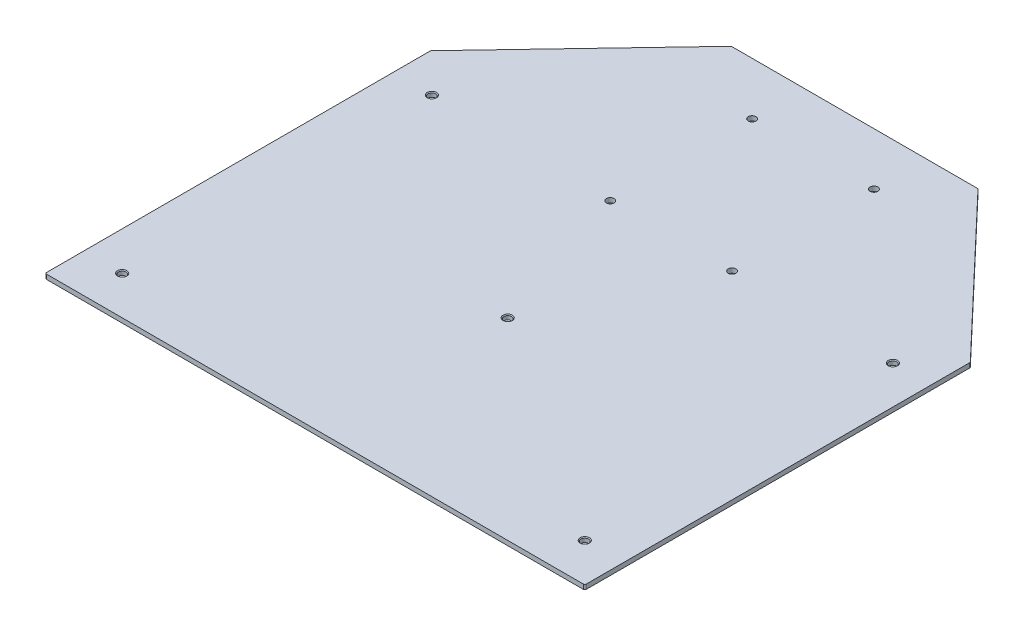
ISO-10303-21;
HEADER;
FILE_DESCRIPTION(('STEP AP214'),'2;1');
FILE_NAME('part.step','',(''),(''),'','','');
FILE_SCHEMA(('AUTOMOTIVE_DESIGN { 1 0 10303 214 1 1 1 1 }'));
ENDSEC;
DATA;
#1=APPLICATION_CONTEXT('core data for automotive mechanical design processes');
#2=APPLICATION_PROTOCOL_DEFINITION('international standard','automotive_design',2000,#1);
#3=PRODUCT_CONTEXT('',#1,'mechanical');
#4=PRODUCT('Part','Part','',(#3));
#5=PRODUCT_RELATED_PRODUCT_CATEGORY('part','',(#4));
#6=PRODUCT_DEFINITION_FORMATION('','',#4);
#7=PRODUCT_DEFINITION_CONTEXT('part definition',#1,'design');
#8=PRODUCT_DEFINITION('design','',#6,#7);
#9=PRODUCT_DEFINITION_SHAPE('','',#8);
#10=(LENGTH_UNIT() NAMED_UNIT(*) SI_UNIT(.MILLI.,.METRE.));
#11=(NAMED_UNIT(*) PLANE_ANGLE_UNIT() SI_UNIT($,.RADIAN.));
#12=(NAMED_UNIT(*) SI_UNIT($,.STERADIAN.) SOLID_ANGLE_UNIT());
#13=UNCERTAINTY_MEASURE_WITH_UNIT(LENGTH_MEASURE(1.E-05),#10,'distance_accuracy_value','');
#14=(GEOMETRIC_REPRESENTATION_CONTEXT(3) GLOBAL_UNCERTAINTY_ASSIGNED_CONTEXT((#13)) GLOBAL_UNIT_ASSIGNED_CONTEXT((#10,
#11,#12)) REPRESENTATION_CONTEXT('',''));
#15=CARTESIAN_POINT('',(0.,0.,0.));
#16=DIRECTION('',(0.,0.,1.));
#17=DIRECTION('',(1.,0.,0.));
#18=AXIS2_PLACEMENT_3D('',#15,#16,#17);
#19=CARTESIAN_POINT('',(-174.,3.,-124.600736952658));
#20=DIRECTION('',(0.,-1.,0.));
#21=DIRECTION('',(0.,0.,-1.));
#22=AXIS2_PLACEMENT_3D('',#19,#20,#21);
#23=CYLINDRICAL_SURFACE('',#22,0.999999999999998);
#24=CARTESIAN_POINT('',(-174.,0.,-124.600736952658));
#25=DIRECTION('',(0.,1.,0.));
#26=DIRECTION('',(0.,0.,1.));
#27=AXIS2_PLACEMENT_3D('',#24,#25,#26);
#28=CIRCLE('',#27,0.999999999999998);
#29=CARTESIAN_POINT('',(-174.725013849983,0.,-125.289471239109));
#30=VERTEX_POINT('',#29);
#31=CARTESIAN_POINT('',(-175.,0.,-124.600736952658));
#32=VERTEX_POINT('',#31);
#33=EDGE_CURVE('E186',#30,#32,#28,.T.);
#34=ORIENTED_EDGE('',*,*,#33,.T.);
#35=DIRECTION('',(0.,-1.,0.));
#36=VECTOR('',#35,1.);
#37=CARTESIAN_POINT('',(-175.,3.,-124.600736952658));
#38=LINE('',#37,#36);
#39=CARTESIAN_POINT('',(-175.,3.,-124.600736952658));
#40=VERTEX_POINT('',#39);
#41=EDGE_CURVE('E11',#40,#32,#38,.T.);
#42=ORIENTED_EDGE('',*,*,#41,.F.);
#43=CARTESIAN_POINT('',(-174.,3.,-124.600736952658));
#44=DIRECTION('',(0.,1.,0.));
#45=DIRECTION('',(0.,0.,1.));
#46=AXIS2_PLACEMENT_3D('',#43,#44,#45);
#47=CIRCLE('',#46,0.999999999999998);
#48=CARTESIAN_POINT('',(-174.725013849983,3.,-125.289471239109));
#49=VERTEX_POINT('',#48);
#50=EDGE_CURVE('E229',#49,#40,#47,.T.);
#51=ORIENTED_EDGE('',*,*,#50,.F.);
#52=DIRECTION('',(0.,-1.,0.));
#53=VECTOR('',#52,1.);
#54=CARTESIAN_POINT('',(-174.725013849983,3.,-125.289471239109));
#55=LINE('',#54,#53);
#56=EDGE_CURVE('E74',#49,#30,#55,.T.);
#57=ORIENTED_EDGE('',*,*,#56,.T.);
#58=EDGE_LOOP('',(#34,#42,#51,#57));
#59=FACE_BOUND('',#58,.T.);
#60=ADVANCED_FACE('F55',(#59),#23,.T.);
#61=CARTESIAN_POINT('',(-175.,3.,-124.600736952658));
#62=DIRECTION('',(1.,0.,0.));
#63=DIRECTION('',(0.,0.,-1.));
#64=AXIS2_PLACEMENT_3D('',#61,#62,#63);
#65=PLANE('',#64);
#66=DIRECTION('',(0.,0.,1.));
#67=VECTOR('',#66,1.);
#68=CARTESIAN_POINT('',(-175.,0.,-124.600736952658));
#69=LINE('',#68,#67);
#70=CARTESIAN_POINT('',(-175.,0.,124.));
#71=VERTEX_POINT('',#70);
#72=EDGE_CURVE('E189',#32,#71,#69,.T.);
#73=ORIENTED_EDGE('',*,*,#72,.T.);
#74=DIRECTION('',(0.,-1.,0.));
#75=VECTOR('',#74,1.);
#76=CARTESIAN_POINT('',(-175.,3.,124.));
#77=LINE('',#76,#75);
#78=CARTESIAN_POINT('',(-175.,3.,124.));
#79=VERTEX_POINT('',#78);
#80=EDGE_CURVE('E65',#79,#71,#77,.T.);
#81=ORIENTED_EDGE('',*,*,#80,.F.);
#82=DIRECTION('',(0.,0.,1.));
#83=VECTOR('',#82,1.);
#84=CARTESIAN_POINT('',(-175.,3.,-124.600736952658));
#85=LINE('',#84,#83);
#86=EDGE_CURVE('E125',#40,#79,#85,.T.);
#87=ORIENTED_EDGE('',*,*,#86,.F.);
#88=ORIENTED_EDGE('',*,*,#41,.T.);
#89=EDGE_LOOP('',(#73,#81,#87,#88));
#90=FACE_BOUND('',#89,.T.);
#91=ADVANCED_FACE('F404',(#90),#65,.F.);
#92=CARTESIAN_POINT('',(-174.,3.,124.));
#93=DIRECTION('',(0.,-1.,0.));
#94=DIRECTION('',(0.,0.,-1.));
#95=AXIS2_PLACEMENT_3D('',#92,#93,#94);
#96=CYLINDRICAL_SURFACE('',#95,1.);
#97=CARTESIAN_POINT('',(-174.,0.,124.));
#98=DIRECTION('',(0.,1.,0.));
#99=DIRECTION('',(0.,0.,1.));
#100=AXIS2_PLACEMENT_3D('',#97,#98,#99);
#101=CIRCLE('',#100,1.);
#102=CARTESIAN_POINT('',(-174.,0.,125.));
#103=VERTEX_POINT('',#102);
#104=EDGE_CURVE('E193',#71,#103,#101,.T.);
#105=ORIENTED_EDGE('',*,*,#104,.T.);
#106=DIRECTION('',(0.,-1.,0.));
#107=VECTOR('',#106,1.);
#108=CARTESIAN_POINT('',(-174.,3.,125.));
#109=LINE('',#108,#107);
#110=CARTESIAN_POINT('',(-174.,3.,125.));
#111=VERTEX_POINT('',#110);
#112=EDGE_CURVE('E251',#111,#103,#109,.T.);
#113=ORIENTED_EDGE('',*,*,#112,.F.);
#114=CARTESIAN_POINT('',(-174.,3.,124.));
#115=DIRECTION('',(0.,1.,0.));
#116=DIRECTION('',(0.,0.,1.));
#117=AXIS2_PLACEMENT_3D('',#114,#115,#116);
#118=CIRCLE('',#117,1.);
#119=EDGE_CURVE('E361',#79,#111,#118,.T.);
#120=ORIENTED_EDGE('',*,*,#119,.F.);
#121=ORIENTED_EDGE('',*,*,#80,.T.);
#122=EDGE_LOOP('',(#105,#113,#120,#121));
#123=FACE_BOUND('',#122,.T.);
#124=ADVANCED_FACE('F408',(#123),#96,.T.);
#125=CARTESIAN_POINT('',(-174.,3.,125.));
#126=DIRECTION('',(0.,0.,-1.));
#127=DIRECTION('',(-1.,0.,0.));
#128=AXIS2_PLACEMENT_3D('',#125,#126,#127);
#129=PLANE('',#128);
#130=DIRECTION('',(1.,0.,0.));
#131=VECTOR('',#130,1.);
#132=CARTESIAN_POINT('',(-174.,0.,125.));
#133=LINE('',#132,#131);
#134=CARTESIAN_POINT('',(174.,0.,125.));
#135=VERTEX_POINT('',#134);
#136=EDGE_CURVE('E196',#103,#135,#133,.T.);
#137=ORIENTED_EDGE('',*,*,#136,.T.);
#138=DIRECTION('',(0.,-1.,0.));
#139=VECTOR('',#138,1.);
#140=CARTESIAN_POINT('',(174.,3.,125.));
#141=LINE('',#140,#139);
#142=CARTESIAN_POINT('',(174.,3.,125.));
#143=VERTEX_POINT('',#142);
#144=EDGE_CURVE('E248',#143,#135,#141,.T.);
#145=ORIENTED_EDGE('',*,*,#144,.F.);
#146=DIRECTION('',(1.,0.,0.));
#147=VECTOR('',#146,1.);
#148=CARTESIAN_POINT('',(-174.,3.,125.));
#149=LINE('',#148,#147);
#150=EDGE_CURVE('E364',#111,#143,#149,.T.);
#151=ORIENTED_EDGE('',*,*,#150,.F.);
#152=ORIENTED_EDGE('',*,*,#112,.T.);
#153=EDGE_LOOP('',(#137,#145,#151,#152));
#154=FACE_BOUND('',#153,.T.);
#155=ADVANCED_FACE('F418',(#154),#129,.F.);
#156=CARTESIAN_POINT('',(174.,3.,124.));
#157=DIRECTION('',(0.,-1.,0.));
#158=DIRECTION('',(0.,0.,-1.));
#159=AXIS2_PLACEMENT_3D('',#156,#157,#158);
#160=CYLINDRICAL_SURFACE('',#159,1.);
#161=CARTESIAN_POINT('',(174.,0.,124.));
#162=DIRECTION('',(0.,-1.,0.));
#163=DIRECTION('',(0.,0.,-1.));
#164=AXIS2_PLACEMENT_3D('',#161,#162,#163);
#165=CIRCLE('',#164,1.);
#166=CARTESIAN_POINT('',(175.,0.,124.));
#167=VERTEX_POINT('',#166);
#168=EDGE_CURVE('E200',#167,#135,#165,.T.);
#169=ORIENTED_EDGE('',*,*,#168,.F.);
#170=DIRECTION('',(0.,-1.,0.));
#171=VECTOR('',#170,1.);
#172=CARTESIAN_POINT('',(175.,3.,124.));
#173=LINE('',#172,#171);
#174=CARTESIAN_POINT('',(175.,3.,124.));
#175=VERTEX_POINT('',#174);
#176=EDGE_CURVE('E245',#175,#167,#173,.T.);
#177=ORIENTED_EDGE('',*,*,#176,.F.);
#178=CARTESIAN_POINT('',(174.,3.,124.));
#179=DIRECTION('',(0.,-1.,0.));
#180=DIRECTION('',(0.,0.,-1.));
#181=AXIS2_PLACEMENT_3D('',#178,#179,#180);
#182=CIRCLE('',#181,1.);
#183=EDGE_CURVE('E367',#175,#143,#182,.T.);
#184=ORIENTED_EDGE('',*,*,#183,.T.);
#185=ORIENTED_EDGE('',*,*,#144,.T.);
#186=EDGE_LOOP('',(#169,#177,#184,#185));
#187=FACE_BOUND('',#186,.T.);
#188=ADVANCED_FACE('F434',(#187),#160,.T.);
#189=CARTESIAN_POINT('',(175.,3.,-124.600736952658));
#190=DIRECTION('',(1.,0.,0.));
#191=DIRECTION('',(0.,0.,-1.));
#192=AXIS2_PLACEMENT_3D('',#189,#190,#191);
#193=PLANE('',#192);
#194=DIRECTION('',(0.,0.,1.));
#195=VECTOR('',#194,1.);
#196=CARTESIAN_POINT('',(175.,0.,-124.600736952658));
#197=LINE('',#196,#195);
#198=CARTESIAN_POINT('',(175.,0.,-124.600736952658));
#199=VERTEX_POINT('',#198);
#200=EDGE_CURVE('E204',#199,#167,#197,.T.);
#201=ORIENTED_EDGE('',*,*,#200,.F.);
#202=DIRECTION('',(0.,-1.,0.));
#203=VECTOR('',#202,1.);
#204=CARTESIAN_POINT('',(175.,3.,-124.600736952658));
#205=LINE('',#204,#203);
#206=CARTESIAN_POINT('',(175.,3.,-124.600736952658));
#207=VERTEX_POINT('',#206);
#208=EDGE_CURVE('E242',#207,#199,#205,.T.);
#209=ORIENTED_EDGE('',*,*,#208,.F.);
#210=DIRECTION('',(0.,0.,1.));
#211=VECTOR('',#210,1.);
#212=CARTESIAN_POINT('',(175.,3.,-124.600736952658));
#213=LINE('',#212,#211);
#214=EDGE_CURVE('E371',#207,#175,#213,.T.);
#215=ORIENTED_EDGE('',*,*,#214,.T.);
#216=ORIENTED_EDGE('',*,*,#176,.T.);
#217=EDGE_LOOP('',(#201,#209,#215,#216));
#218=FACE_BOUND('',#217,.T.);
#219=ADVANCED_FACE('F424',(#218),#193,.T.);
#220=CARTESIAN_POINT('',(174.,3.,-124.600736952658));
#221=DIRECTION('',(0.,-1.,0.));
#222=DIRECTION('',(0.,0.,-1.));
#223=AXIS2_PLACEMENT_3D('',#220,#221,#222);
#224=CYLINDRICAL_SURFACE('',#223,0.999999999999998);
#225=CARTESIAN_POINT('',(174.,0.,-124.600736952658));
#226=DIRECTION('',(0.,-1.,0.));
#227=DIRECTION('',(0.,0.,-1.));
#228=AXIS2_PLACEMENT_3D('',#225,#226,#227);
#229=CIRCLE('',#228,0.999999999999998);
#230=CARTESIAN_POINT('',(174.725013849983,0.,-125.289471239109));
#231=VERTEX_POINT('',#230);
#232=EDGE_CURVE('E208',#231,#199,#229,.T.);
#233=ORIENTED_EDGE('',*,*,#232,.F.);
#234=DIRECTION('',(0.,-1.,0.));
#235=VECTOR('',#234,1.);
#236=CARTESIAN_POINT('',(174.725013849983,3.,-125.289471239109));
#237=LINE('',#236,#235);
#238=CARTESIAN_POINT('',(174.725013849983,3.,-125.289471239109));
#239=VERTEX_POINT('',#238);
#240=EDGE_CURVE('E239',#239,#231,#237,.T.);
#241=ORIENTED_EDGE('',*,*,#240,.F.);
#242=CARTESIAN_POINT('',(174.,3.,-124.600736952658));
#243=DIRECTION('',(0.,-1.,0.));
#244=DIRECTION('',(0.,0.,-1.));
#245=AXIS2_PLACEMENT_3D('',#242,#243,#244);
#246=CIRCLE('',#245,0.999999999999998);
#247=EDGE_CURVE('E375',#239,#207,#246,.T.);
#248=ORIENTED_EDGE('',*,*,#247,.T.);
#249=ORIENTED_EDGE('',*,*,#208,.T.);
#250=EDGE_LOOP('',(#233,#241,#248,#249));
#251=FACE_BOUND('',#250,.T.);
#252=ADVANCED_FACE('F426',(#251),#224,.T.);
#253=CARTESIAN_POINT('',(80.2956900328497,3.,-224.692926183626));
#254=DIRECTION('',(0.725013849983001,0.,-0.688734286450752));
#255=DIRECTION('',(-0.688734286450752,0.,-0.725013849983001));
#256=AXIS2_PLACEMENT_3D('',#253,#254,#255);
#257=PLANE('',#256);
#258=DIRECTION('',(0.688734286450752,0.,0.725013849983001));
#259=VECTOR('',#258,1.);
#260=CARTESIAN_POINT('',(80.2956900328497,0.,-224.692926183626));
#261=LINE('',#260,#259);
#262=CARTESIAN_POINT('',(80.2956900328497,0.,-224.692926183626));
#263=VERTEX_POINT('',#262);
#264=EDGE_CURVE('E212',#263,#231,#261,.T.);
#265=ORIENTED_EDGE('',*,*,#264,.F.);
#266=DIRECTION('',(0.,-1.,0.));
#267=VECTOR('',#266,1.);
#268=CARTESIAN_POINT('',(80.2956900328497,3.,-224.692926183626));
#269=LINE('',#268,#267);
#270=CARTESIAN_POINT('',(80.2956900328497,3.,-224.692926183626));
#271=VERTEX_POINT('',#270);
#272=EDGE_CURVE('E236',#271,#263,#269,.T.);
#273=ORIENTED_EDGE('',*,*,#272,.F.);
#274=DIRECTION('',(0.688734286450752,0.,0.725013849983001));
#275=VECTOR('',#274,1.);
#276=CARTESIAN_POINT('',(80.2956900328497,3.,-224.692926183626));
#277=LINE('',#276,#275);
#278=EDGE_CURVE('E180',#271,#239,#277,.T.);
#279=ORIENTED_EDGE('',*,*,#278,.T.);
#280=ORIENTED_EDGE('',*,*,#240,.T.);
#281=EDGE_LOOP('',(#265,#273,#279,#280));
#282=FACE_BOUND('',#281,.T.);
#283=ADVANCED_FACE('F382',(#282),#257,.T.);
#284=CARTESIAN_POINT('',(79.5706761828666,3.,-224.004191897175));
#285=DIRECTION('',(0.,-1.,0.));
#286=DIRECTION('',(0.,0.,-1.));
#287=AXIS2_PLACEMENT_3D('',#284,#285,#286);
#288=CYLINDRICAL_SURFACE('',#287,1.);
#289=CARTESIAN_POINT('',(79.5706761828666,0.,-224.004191897175));
#290=DIRECTION('',(0.,-1.,0.));
#291=DIRECTION('',(0.,0.,-1.));
#292=AXIS2_PLACEMENT_3D('',#289,#290,#291);
#293=CIRCLE('',#292,1.);
#294=CARTESIAN_POINT('',(79.5706761828666,0.,-225.004191897175));
#295=VERTEX_POINT('',#294);
#296=EDGE_CURVE('E216',#295,#263,#293,.T.);
#297=ORIENTED_EDGE('',*,*,#296,.F.);
#298=DIRECTION('',(0.,-1.,0.));
#299=VECTOR('',#298,1.);
#300=CARTESIAN_POINT('',(79.5706761828666,3.,-225.004191897175));
#301=LINE('',#300,#299);
#302=CARTESIAN_POINT('',(79.5706761828666,3.,-225.004191897175));
#303=VERTEX_POINT('',#302);
#304=EDGE_CURVE('E163',#303,#295,#301,.T.);
#305=ORIENTED_EDGE('',*,*,#304,.F.);
#306=CARTESIAN_POINT('',(79.5706761828666,3.,-224.004191897175));
#307=DIRECTION('',(0.,-1.,0.));
#308=DIRECTION('',(0.,0.,-1.));
#309=AXIS2_PLACEMENT_3D('',#306,#307,#308);
#310=CIRCLE('',#309,1.);
#311=EDGE_CURVE('E176',#303,#271,#310,.T.);
#312=ORIENTED_EDGE('',*,*,#311,.T.);
#313=ORIENTED_EDGE('',*,*,#272,.T.);
#314=EDGE_LOOP('',(#297,#305,#312,#313));
#315=FACE_BOUND('',#314,.T.);
#316=ADVANCED_FACE('F388',(#315),#288,.T.);
#317=CARTESIAN_POINT('',(-79.5706761828666,3.,-225.004191897175));
#318=DIRECTION('',(0.,0.,-1.));
#319=DIRECTION('',(-1.,0.,0.));
#320=AXIS2_PLACEMENT_3D('',#317,#318,#319);
#321=PLANE('',#320);
#322=DIRECTION('',(1.,0.,0.));
#323=VECTOR('',#322,1.);
#324=CARTESIAN_POINT('',(-79.5706761828666,0.,-225.004191897175));
#325=LINE('',#324,#323);
#326=CARTESIAN_POINT('',(-79.5706761828666,0.,-225.004191897175));
#327=VERTEX_POINT('',#326);
#328=EDGE_CURVE('E159',#327,#295,#325,.T.);
#329=ORIENTED_EDGE('',*,*,#328,.F.);
#330=DIRECTION('',(0.,-1.,0.));
#331=VECTOR('',#330,1.);
#332=CARTESIAN_POINT('',(-79.5706761828666,3.,-225.004191897175));
#333=LINE('',#332,#331);
#334=CARTESIAN_POINT('',(-79.5706761828666,3.,-225.004191897175));
#335=VERTEX_POINT('',#334);
#336=EDGE_CURVE('E153',#335,#327,#333,.T.);
#337=ORIENTED_EDGE('',*,*,#336,.F.);
#338=DIRECTION('',(1.,0.,0.));
#339=VECTOR('',#338,1.);
#340=CARTESIAN_POINT('',(-79.5706761828666,3.,-225.004191897175));
#341=LINE('',#340,#339);
#342=EDGE_CURVE('E157',#335,#303,#341,.T.);
#343=ORIENTED_EDGE('',*,*,#342,.T.);
#344=ORIENTED_EDGE('',*,*,#304,.T.);
#345=EDGE_LOOP('',(#329,#337,#343,#344));
#346=FACE_BOUND('',#345,.T.);
#347=ADVANCED_FACE('F155',(#346),#321,.T.);
#348=CARTESIAN_POINT('',(-79.5706761828666,3.,-224.004191897175));
#349=DIRECTION('',(0.,-1.,0.));
#350=DIRECTION('',(0.,0.,-1.));
#351=AXIS2_PLACEMENT_3D('',#348,#349,#350);
#352=CYLINDRICAL_SURFACE('',#351,1.);
#353=CARTESIAN_POINT('',(-79.5706761828666,0.,-224.004191897175));
#354=DIRECTION('',(0.,1.,0.));
#355=DIRECTION('',(0.,0.,1.));
#356=AXIS2_PLACEMENT_3D('',#353,#354,#355);
#357=CIRCLE('',#356,1.);
#358=CARTESIAN_POINT('',(-80.2956900328497,0.,-224.692926183626));
#359=VERTEX_POINT('',#358);
#360=EDGE_CURVE('E222',#327,#359,#357,.T.);
#361=ORIENTED_EDGE('',*,*,#360,.T.);
#362=DIRECTION('',(0.,-1.,0.));
#363=VECTOR('',#362,1.);
#364=CARTESIAN_POINT('',(-80.2956900328497,3.,-224.692926183626));
#365=LINE('',#364,#363);
#366=CARTESIAN_POINT('',(-80.2956900328497,3.,-224.692926183626));
#367=VERTEX_POINT('',#366);
#368=EDGE_CURVE('E113',#367,#359,#365,.T.);
#369=ORIENTED_EDGE('',*,*,#368,.F.);
#370=CARTESIAN_POINT('',(-79.5706761828666,3.,-224.004191897175));
#371=DIRECTION('',(0.,1.,0.));
#372=DIRECTION('',(0.,0.,1.));
#373=AXIS2_PLACEMENT_3D('',#370,#371,#372);
#374=CIRCLE('',#373,1.);
#375=EDGE_CURVE('E165',#335,#367,#374,.T.);
#376=ORIENTED_EDGE('',*,*,#375,.F.);
#377=ORIENTED_EDGE('',*,*,#336,.T.);
#378=EDGE_LOOP('',(#361,#369,#376,#377));
#379=FACE_BOUND('',#378,.T.);
#380=ADVANCED_FACE('F166',(#379),#352,.T.);
#381=CARTESIAN_POINT('',(-174.725013849983,3.,-125.289471239109));
#382=DIRECTION('',(-0.725013849983,0.,-0.688734286450753));
#383=DIRECTION('',(-0.688734286450753,0.,0.725013849983));
#384=AXIS2_PLACEMENT_3D('',#381,#382,#383);
#385=PLANE('',#384);
#386=DIRECTION('',(0.688734286450752,0.,-0.725013849983));
#387=VECTOR('',#386,1.);
#388=CARTESIAN_POINT('',(-174.725013849983,0.,-125.289471239109));
#389=LINE('',#388,#387);
#390=EDGE_CURVE('E225',#30,#359,#389,.T.);
#391=ORIENTED_EDGE('',*,*,#390,.F.);
#392=ORIENTED_EDGE('',*,*,#56,.F.);
#393=DIRECTION('',(0.688734286450752,0.,-0.725013849983));
#394=VECTOR('',#393,1.);
#395=CARTESIAN_POINT('',(-174.725013849983,3.,-125.289471239109));
#396=LINE('',#395,#394);
#397=EDGE_CURVE('E170',#49,#367,#396,.T.);
#398=ORIENTED_EDGE('',*,*,#397,.T.);
#399=ORIENTED_EDGE('',*,*,#368,.T.);
#400=EDGE_LOOP('',(#391,#392,#398,#399));
#401=FACE_BOUND('',#400,.T.);
#402=ADVANCED_FACE('F391',(#401),#385,.T.);
#403=CARTESIAN_POINT('',(-174.,3.,-124.600736952658));
#404=DIRECTION('',(0.,1.,0.));
#405=DIRECTION('',(0.,0.,1.));
#406=AXIS2_PLACEMENT_3D('',#403,#404,#405);
#407=PLANE('',#406);
#408=CARTESIAN_POINT('',(46.5,3.,-191.004191906175));
#409=DIRECTION('',(0.,1.,0.));
#410=DIRECTION('',(0.,0.,1.));
#411=AXIS2_PLACEMENT_3D('',#408,#409,#410);
#412=CIRCLE('',#411,2.49999999999999);
#413=CARTESIAN_POINT('',(46.5,3.,-188.504191906175));
#414=VERTEX_POINT('',#413);
#415=EDGE_CURVE('E58',#414,#414,#412,.T.);
#416=ORIENTED_EDGE('',*,*,#415,.F.);
#417=EDGE_LOOP('',(#416));
#418=FACE_BOUND('',#417,.T.);
#419=CARTESIAN_POINT('',(-32.5,3.,-191.004191906175));
#420=DIRECTION('',(0.,1.,0.));
#421=DIRECTION('',(0.,0.,1.));
#422=AXIS2_PLACEMENT_3D('',#419,#420,#421);
#423=CIRCLE('',#422,2.49999999999999);
#424=CARTESIAN_POINT('',(-32.5,3.,-188.504191906175));
#425=VERTEX_POINT('',#424);
#426=EDGE_CURVE('E269',#425,#425,#423,.T.);
#427=ORIENTED_EDGE('',*,*,#426,.F.);
#428=EDGE_LOOP('',(#427));
#429=FACE_BOUND('',#428,.T.);
#430=CARTESIAN_POINT('',(-32.5,3.,-99.0041918971752));
#431=DIRECTION('',(0.,1.,0.));
#432=DIRECTION('',(0.,0.,1.));
#433=AXIS2_PLACEMENT_3D('',#430,#431,#432);
#434=CIRCLE('',#433,2.49999999999999);
#435=CARTESIAN_POINT('',(-32.5,3.,-96.5041918971752));
#436=VERTEX_POINT('',#435);
#437=EDGE_CURVE('E264',#436,#436,#434,.T.);
#438=ORIENTED_EDGE('',*,*,#437,.F.);
#439=EDGE_LOOP('',(#438));
#440=FACE_BOUND('',#439,.T.);
#441=CARTESIAN_POINT('',(46.5,3.,-99.0041918971752));
#442=DIRECTION('',(0.,1.,0.));
#443=DIRECTION('',(0.,0.,1.));
#444=AXIS2_PLACEMENT_3D('',#441,#442,#443);
#445=CIRCLE('',#444,2.49999999999999);
#446=CARTESIAN_POINT('',(46.5,3.,-96.5041918971752));
#447=VERTEX_POINT('',#446);
#448=EDGE_CURVE('E258',#447,#447,#445,.T.);
#449=ORIENTED_EDGE('',*,*,#448,.F.);
#450=EDGE_LOOP('',(#449));
#451=FACE_BOUND('',#450,.T.);
#452=CARTESIAN_POINT('',(-150.,3.,100.));
#453=DIRECTION('',(0.,1.,0.));
#454=DIRECTION('',(0.,0.,1.));
#455=AXIS2_PLACEMENT_3D('',#452,#453,#454);
#456=CIRCLE('',#455,3.025);
#457=CARTESIAN_POINT('',(-150.,3.,103.025));
#458=VERTEX_POINT('',#457);
#459=EDGE_CURVE('E262',#458,#458,#456,.T.);
#460=ORIENTED_EDGE('',*,*,#459,.F.);
#461=EDGE_LOOP('',(#460));
#462=FACE_BOUND('',#461,.T.);
#463=CARTESIAN_POINT('',(150.,3.,100.));
#464=DIRECTION('',(0.,1.,0.));
#465=DIRECTION('',(0.,0.,1.));
#466=AXIS2_PLACEMENT_3D('',#463,#464,#465);
#467=CIRCLE('',#466,3.025);
#468=CARTESIAN_POINT('',(150.,3.,103.025));
#469=VERTEX_POINT('',#468);
#470=EDGE_CURVE('E310',#469,#469,#467,.T.);
#471=ORIENTED_EDGE('',*,*,#470,.F.);
#472=EDGE_LOOP('',(#471));
#473=FACE_BOUND('',#472,.T.);
#474=CARTESIAN_POINT('',(0.,3.,0.));
#475=DIRECTION('',(0.,1.,0.));
#476=DIRECTION('',(0.,0.,1.));
#477=AXIS2_PLACEMENT_3D('',#474,#475,#476);
#478=CIRCLE('',#477,3.025);
#479=CARTESIAN_POINT('',(0.,3.,3.025));
#480=VERTEX_POINT('',#479);
#481=EDGE_CURVE('E322',#480,#480,#478,.T.);
#482=ORIENTED_EDGE('',*,*,#481,.F.);
#483=EDGE_LOOP('',(#482));
#484=FACE_BOUND('',#483,.T.);
#485=CARTESIAN_POINT('',(-149.655838955515,3.,-100.514326672973));
#486=DIRECTION('',(0.,1.,0.));
#487=DIRECTION('',(0.,0.,1.));
#488=AXIS2_PLACEMENT_3D('',#485,#486,#487);
#489=CIRCLE('',#488,3.025);
#490=CARTESIAN_POINT('',(-149.655838955515,3.,-97.4893266729726));
#491=VERTEX_POINT('',#490);
#492=EDGE_CURVE('E334',#491,#491,#489,.T.);
#493=ORIENTED_EDGE('',*,*,#492,.F.);
#494=EDGE_LOOP('',(#493));
#495=FACE_BOUND('',#494,.T.);
#496=CARTESIAN_POINT('',(150.34239345025,3.,-99.4844949308703));
#497=DIRECTION('',(0.,1.,0.));
#498=DIRECTION('',(0.,0.,1.));
#499=AXIS2_PLACEMENT_3D('',#496,#497,#498);
#500=CIRCLE('',#499,3.025);
#501=CARTESIAN_POINT('',(150.34239345025,3.,-96.4594949308702));
#502=VERTEX_POINT('',#501);
#503=EDGE_CURVE('E346',#502,#502,#500,.T.);
#504=ORIENTED_EDGE('',*,*,#503,.F.);
#505=EDGE_LOOP('',(#504));
#506=FACE_BOUND('',#505,.T.);
#507=ORIENTED_EDGE('',*,*,#50,.T.);
#508=ORIENTED_EDGE('',*,*,#86,.T.);
#509=ORIENTED_EDGE('',*,*,#119,.T.);
#510=ORIENTED_EDGE('',*,*,#150,.T.);
#511=ORIENTED_EDGE('',*,*,#183,.F.);
#512=ORIENTED_EDGE('',*,*,#214,.F.);
#513=ORIENTED_EDGE('',*,*,#247,.F.);
#514=ORIENTED_EDGE('',*,*,#278,.F.);
#515=ORIENTED_EDGE('',*,*,#311,.F.);
#516=ORIENTED_EDGE('',*,*,#342,.F.);
#517=ORIENTED_EDGE('',*,*,#375,.T.);
#518=ORIENTED_EDGE('',*,*,#397,.F.);
#519=EDGE_LOOP('',(#507,#508,#509,#510,#511,#512,#513,#514,#515,#516,#517,#518));
#520=FACE_BOUND('',#519,.T.);
#521=ADVANCED_FACE('F173',(#418,#429,#440,#451,#462,#473,#484,#495,#506,#520),#407,.T.);
#522=CARTESIAN_POINT('',(-174.,0.,-124.600736952658));
#523=DIRECTION('',(0.,1.,0.));
#524=DIRECTION('',(0.,0.,1.));
#525=AXIS2_PLACEMENT_3D('',#522,#523,#524);
#526=PLANE('',#525);
#527=CARTESIAN_POINT('',(46.5,0.,-191.004191906175));
#528=DIRECTION('',(0.,-1.,0.));
#529=DIRECTION('',(0.,0.,-1.));
#530=AXIS2_PLACEMENT_3D('',#527,#528,#529);
#531=CIRCLE('',#530,2.525);
#532=CARTESIAN_POINT('',(46.5,0.,-193.529191906175));
#533=VERTEX_POINT('',#532);
#534=EDGE_CURVE('E675',#533,#533,#531,.T.);
#535=ORIENTED_EDGE('',*,*,#534,.F.);
#536=EDGE_LOOP('',(#535));
#537=FACE_BOUND('',#536,.T.);
#538=CARTESIAN_POINT('',(-32.5,0.,-191.004191906175));
#539=DIRECTION('',(0.,-1.,0.));
#540=DIRECTION('',(0.,0.,-1.));
#541=AXIS2_PLACEMENT_3D('',#538,#539,#540);
#542=CIRCLE('',#541,2.525);
#543=CARTESIAN_POINT('',(-32.5,0.,-193.529191906175));
#544=VERTEX_POINT('',#543);
#545=EDGE_CURVE('E281',#544,#544,#542,.T.);
#546=ORIENTED_EDGE('',*,*,#545,.F.);
#547=EDGE_LOOP('',(#546));
#548=FACE_BOUND('',#547,.T.);
#549=CARTESIAN_POINT('',(-32.5,0.,-99.0041918971752));
#550=DIRECTION('',(0.,-1.,0.));
#551=DIRECTION('',(0.,0.,-1.));
#552=AXIS2_PLACEMENT_3D('',#549,#550,#551);
#553=CIRCLE('',#552,2.525);
#554=CARTESIAN_POINT('',(-32.5,0.,-101.529191897175));
#555=VERTEX_POINT('',#554);
#556=EDGE_CURVE('E272',#555,#555,#553,.T.);
#557=ORIENTED_EDGE('',*,*,#556,.F.);
#558=EDGE_LOOP('',(#557));
#559=FACE_BOUND('',#558,.T.);
#560=CARTESIAN_POINT('',(46.5,0.,-99.0041918971752));
#561=DIRECTION('',(0.,-1.,0.));
#562=DIRECTION('',(0.,0.,-1.));
#563=AXIS2_PLACEMENT_3D('',#560,#561,#562);
#564=CIRCLE('',#563,2.525);
#565=CARTESIAN_POINT('',(46.5,0.,-101.529191897175));
#566=VERTEX_POINT('',#565);
#567=EDGE_CURVE('E267',#566,#566,#564,.T.);
#568=ORIENTED_EDGE('',*,*,#567,.F.);
#569=EDGE_LOOP('',(#568));
#570=FACE_BOUND('',#569,.T.);
#571=CARTESIAN_POINT('',(-150.,0.,100.));
#572=DIRECTION('',(0.,1.,0.));
#573=DIRECTION('',(0.,0.,1.));
#574=AXIS2_PLACEMENT_3D('',#571,#572,#573);
#575=CIRCLE('',#574,2.5);
#576=CARTESIAN_POINT('',(-150.,0.,102.5));
#577=VERTEX_POINT('',#576);
#578=EDGE_CURVE('E306',#577,#577,#575,.T.);
#579=ORIENTED_EDGE('',*,*,#578,.T.);
#580=EDGE_LOOP('',(#579));
#581=FACE_BOUND('',#580,.T.);
#582=CARTESIAN_POINT('',(150.,0.,100.));
#583=DIRECTION('',(0.,1.,0.));
#584=DIRECTION('',(0.,0.,1.));
#585=AXIS2_PLACEMENT_3D('',#582,#583,#584);
#586=CIRCLE('',#585,2.5);
#587=CARTESIAN_POINT('',(150.,0.,102.5));
#588=VERTEX_POINT('',#587);
#589=EDGE_CURVE('E318',#588,#588,#586,.T.);
#590=ORIENTED_EDGE('',*,*,#589,.T.);
#591=EDGE_LOOP('',(#590));
#592=FACE_BOUND('',#591,.T.);
#593=CARTESIAN_POINT('',(0.,0.,0.));
#594=DIRECTION('',(0.,1.,0.));
#595=DIRECTION('',(0.,0.,1.));
#596=AXIS2_PLACEMENT_3D('',#593,#594,#595);
#597=CIRCLE('',#596,2.5);
#598=CARTESIAN_POINT('',(0.,0.,2.5));
#599=VERTEX_POINT('',#598);
#600=EDGE_CURVE('E330',#599,#599,#597,.T.);
#601=ORIENTED_EDGE('',*,*,#600,.T.);
#602=EDGE_LOOP('',(#601));
#603=FACE_BOUND('',#602,.T.);
#604=CARTESIAN_POINT('',(-149.655838955515,0.,-100.514326672973));
#605=DIRECTION('',(0.,1.,0.));
#606=DIRECTION('',(0.,0.,1.));
#607=AXIS2_PLACEMENT_3D('',#604,#605,#606);
#608=CIRCLE('',#607,2.5);
#609=CARTESIAN_POINT('',(-149.655838955515,0.,-98.0143266729726));
#610=VERTEX_POINT('',#609);
#611=EDGE_CURVE('E342',#610,#610,#608,.T.);
#612=ORIENTED_EDGE('',*,*,#611,.T.);
#613=EDGE_LOOP('',(#612));
#614=FACE_BOUND('',#613,.T.);
#615=CARTESIAN_POINT('',(150.34239345025,0.,-99.4844949308703));
#616=DIRECTION('',(0.,1.,0.));
#617=DIRECTION('',(0.,0.,1.));
#618=AXIS2_PLACEMENT_3D('',#615,#616,#617);
#619=CIRCLE('',#618,2.5);
#620=CARTESIAN_POINT('',(150.34239345025,0.,-96.9844949308702));
#621=VERTEX_POINT('',#620);
#622=EDGE_CURVE('E190',#621,#621,#619,.T.);
#623=ORIENTED_EDGE('',*,*,#622,.T.);
#624=EDGE_LOOP('',(#623));
#625=FACE_BOUND('',#624,.T.);
#626=ORIENTED_EDGE('',*,*,#33,.F.);
#627=ORIENTED_EDGE('',*,*,#390,.T.);
#628=ORIENTED_EDGE('',*,*,#360,.F.);
#629=ORIENTED_EDGE('',*,*,#328,.T.);
#630=ORIENTED_EDGE('',*,*,#296,.T.);
#631=ORIENTED_EDGE('',*,*,#264,.T.);
#632=ORIENTED_EDGE('',*,*,#232,.T.);
#633=ORIENTED_EDGE('',*,*,#200,.T.);
#634=ORIENTED_EDGE('',*,*,#168,.T.);
#635=ORIENTED_EDGE('',*,*,#136,.F.);
#636=ORIENTED_EDGE('',*,*,#104,.F.);
#637=ORIENTED_EDGE('',*,*,#72,.F.);
#638=EDGE_LOOP('',(#626,#627,#628,#629,#630,#631,#632,#633,#634,#635,#636,#637));
#639=FACE_BOUND('',#638,.T.);
#640=ADVANCED_FACE('F390',(#537,#548,#559,#570,#581,#592,#603,#614,#625,#639),#526,.F.);
#641=CARTESIAN_POINT('',(150.34239345025,3.,-99.4844949308703));
#642=DIRECTION('',(0.,1.,0.));
#643=DIRECTION('',(0.,0.,1.));
#644=AXIS2_PLACEMENT_3D('',#641,#642,#643);
#645=CYLINDRICAL_SURFACE('',#644,2.5);
#646=ORIENTED_EDGE('',*,*,#622,.F.);
#647=EDGE_LOOP('',(#646));
#648=FACE_BOUND('',#647,.T.);
#649=CARTESIAN_POINT('',(150.34239345025,2.475,-99.4844949308703));
#650=DIRECTION('',(0.,1.,0.));
#651=DIRECTION('',(0.,0.,1.));
#652=AXIS2_PLACEMENT_3D('',#649,#650,#651);
#653=CIRCLE('',#652,2.5);
#654=CARTESIAN_POINT('',(150.34239345025,2.475,-96.9844949308702));
#655=VERTEX_POINT('',#654);
#656=EDGE_CURVE('E350',#655,#655,#653,.T.);
#657=ORIENTED_EDGE('',*,*,#656,.T.);
#658=EDGE_LOOP('',(#657));
#659=FACE_BOUND('',#658,.T.);
#660=ADVANCED_FACE('F496',(#648,#659),#645,.F.);
#661=CARTESIAN_POINT('',(150.34239345025,3.,-99.4844949308703));
#662=DIRECTION('',(0.,1.,0.));
#663=DIRECTION('',(0.,0.,1.));
#664=AXIS2_PLACEMENT_3D('',#661,#662,#663);
#665=CONICAL_SURFACE('',#664,3.025,0.785398163397446);
#666=ORIENTED_EDGE('',*,*,#656,.F.);
#667=EDGE_LOOP('',(#666));
#668=FACE_BOUND('',#667,.T.);
#669=ORIENTED_EDGE('',*,*,#503,.T.);
#670=EDGE_LOOP('',(#669));
#671=FACE_BOUND('',#670,.T.);
#672=ADVANCED_FACE('F504',(#668,#671),#665,.F.);
#673=CARTESIAN_POINT('',(-149.655838955515,3.,-100.514326672973));
#674=DIRECTION('',(0.,1.,0.));
#675=DIRECTION('',(0.,0.,1.));
#676=AXIS2_PLACEMENT_3D('',#673,#674,#675);
#677=CYLINDRICAL_SURFACE('',#676,2.5);
#678=ORIENTED_EDGE('',*,*,#611,.F.);
#679=EDGE_LOOP('',(#678));
#680=FACE_BOUND('',#679,.T.);
#681=CARTESIAN_POINT('',(-149.655838955515,2.475,-100.514326672973));
#682=DIRECTION('',(0.,1.,0.));
#683=DIRECTION('',(0.,0.,1.));
#684=AXIS2_PLACEMENT_3D('',#681,#682,#683);
#685=CIRCLE('',#684,2.5);
#686=CARTESIAN_POINT('',(-149.655838955515,2.475,-98.0143266729726));
#687=VERTEX_POINT('',#686);
#688=EDGE_CURVE('E338',#687,#687,#685,.T.);
#689=ORIENTED_EDGE('',*,*,#688,.T.);
#690=EDGE_LOOP('',(#689));
#691=FACE_BOUND('',#690,.T.);
#692=ADVANCED_FACE('F514',(#680,#691),#677,.F.);
#693=CARTESIAN_POINT('',(-149.655838955515,3.,-100.514326672973));
#694=DIRECTION('',(0.,1.,0.));
#695=DIRECTION('',(0.,0.,1.));
#696=AXIS2_PLACEMENT_3D('',#693,#694,#695);
#697=CONICAL_SURFACE('',#696,3.025,0.785398163397446);
#698=ORIENTED_EDGE('',*,*,#688,.F.);
#699=EDGE_LOOP('',(#698));
#700=FACE_BOUND('',#699,.T.);
#701=ORIENTED_EDGE('',*,*,#492,.T.);
#702=EDGE_LOOP('',(#701));
#703=FACE_BOUND('',#702,.T.);
#704=ADVANCED_FACE('F523',(#700,#703),#697,.F.);
#705=CARTESIAN_POINT('',(0.,3.,0.));
#706=DIRECTION('',(0.,1.,0.));
#707=DIRECTION('',(0.,0.,1.));
#708=AXIS2_PLACEMENT_3D('',#705,#706,#707);
#709=CYLINDRICAL_SURFACE('',#708,2.5);
#710=ORIENTED_EDGE('',*,*,#600,.F.);
#711=EDGE_LOOP('',(#710));
#712=FACE_BOUND('',#711,.T.);
#713=CARTESIAN_POINT('',(0.,2.475,0.));
#714=DIRECTION('',(0.,1.,0.));
#715=DIRECTION('',(0.,0.,1.));
#716=AXIS2_PLACEMENT_3D('',#713,#714,#715);
#717=CIRCLE('',#716,2.5);
#718=CARTESIAN_POINT('',(0.,2.475,2.5));
#719=VERTEX_POINT('',#718);
#720=EDGE_CURVE('E326',#719,#719,#717,.T.);
#721=ORIENTED_EDGE('',*,*,#720,.T.);
#722=EDGE_LOOP('',(#721));
#723=FACE_BOUND('',#722,.T.);
#724=ADVANCED_FACE('F533',(#712,#723),#709,.F.);
#725=CARTESIAN_POINT('',(0.,3.,0.));
#726=DIRECTION('',(0.,1.,0.));
#727=DIRECTION('',(0.,0.,1.));
#728=AXIS2_PLACEMENT_3D('',#725,#726,#727);
#729=CONICAL_SURFACE('',#728,3.025,0.785398163397448);
#730=ORIENTED_EDGE('',*,*,#720,.F.);
#731=EDGE_LOOP('',(#730));
#732=FACE_BOUND('',#731,.T.);
#733=ORIENTED_EDGE('',*,*,#481,.T.);
#734=EDGE_LOOP('',(#733));
#735=FACE_BOUND('',#734,.T.);
#736=ADVANCED_FACE('F542',(#732,#735),#729,.F.);
#737=CARTESIAN_POINT('',(150.,3.,100.));
#738=DIRECTION('',(0.,1.,0.));
#739=DIRECTION('',(0.,0.,1.));
#740=AXIS2_PLACEMENT_3D('',#737,#738,#739);
#741=CYLINDRICAL_SURFACE('',#740,2.5);
#742=ORIENTED_EDGE('',*,*,#589,.F.);
#743=EDGE_LOOP('',(#742));
#744=FACE_BOUND('',#743,.T.);
#745=CARTESIAN_POINT('',(150.,2.475,100.));
#746=DIRECTION('',(0.,1.,0.));
#747=DIRECTION('',(0.,0.,1.));
#748=AXIS2_PLACEMENT_3D('',#745,#746,#747);
#749=CIRCLE('',#748,2.5);
#750=CARTESIAN_POINT('',(150.,2.475,102.5));
#751=VERTEX_POINT('',#750);
#752=EDGE_CURVE('E314',#751,#751,#749,.T.);
#753=ORIENTED_EDGE('',*,*,#752,.T.);
#754=EDGE_LOOP('',(#753));
#755=FACE_BOUND('',#754,.T.);
#756=ADVANCED_FACE('F552',(#744,#755),#741,.F.);
#757=CARTESIAN_POINT('',(150.,3.,100.));
#758=DIRECTION('',(0.,1.,0.));
#759=DIRECTION('',(0.,0.,1.));
#760=AXIS2_PLACEMENT_3D('',#757,#758,#759);
#761=CONICAL_SURFACE('',#760,3.025,0.785398163397446);
#762=ORIENTED_EDGE('',*,*,#752,.F.);
#763=EDGE_LOOP('',(#762));
#764=FACE_BOUND('',#763,.T.);
#765=ORIENTED_EDGE('',*,*,#470,.T.);
#766=EDGE_LOOP('',(#765));
#767=FACE_BOUND('',#766,.T.);
#768=ADVANCED_FACE('F561',(#764,#767),#761,.F.);
#769=CARTESIAN_POINT('',(-150.,3.,100.));
#770=DIRECTION('',(0.,1.,0.));
#771=DIRECTION('',(0.,0.,1.));
#772=AXIS2_PLACEMENT_3D('',#769,#770,#771);
#773=CYLINDRICAL_SURFACE('',#772,2.5);
#774=ORIENTED_EDGE('',*,*,#578,.F.);
#775=EDGE_LOOP('',(#774));
#776=FACE_BOUND('',#775,.T.);
#777=CARTESIAN_POINT('',(-150.,2.475,100.));
#778=DIRECTION('',(0.,1.,0.));
#779=DIRECTION('',(0.,0.,1.));
#780=AXIS2_PLACEMENT_3D('',#777,#778,#779);
#781=CIRCLE('',#780,2.5);
#782=CARTESIAN_POINT('',(-150.,2.475,102.5));
#783=VERTEX_POINT('',#782);
#784=EDGE_CURVE('E302',#783,#783,#781,.T.);
#785=ORIENTED_EDGE('',*,*,#784,.T.);
#786=EDGE_LOOP('',(#785));
#787=FACE_BOUND('',#786,.T.);
#788=ADVANCED_FACE('F571',(#776,#787),#773,.F.);
#789=CARTESIAN_POINT('',(-150.,3.,100.));
#790=DIRECTION('',(0.,1.,0.));
#791=DIRECTION('',(0.,0.,1.));
#792=AXIS2_PLACEMENT_3D('',#789,#790,#791);
#793=CONICAL_SURFACE('',#792,3.025,0.785398163397446);
#794=ORIENTED_EDGE('',*,*,#784,.F.);
#795=EDGE_LOOP('',(#794));
#796=FACE_BOUND('',#795,.T.);
#797=ORIENTED_EDGE('',*,*,#459,.T.);
#798=EDGE_LOOP('',(#797));
#799=FACE_BOUND('',#798,.T.);
#800=ADVANCED_FACE('F580',(#796,#799),#793,.F.);
#801=CARTESIAN_POINT('',(46.5,0.,-99.0041918971752));
#802=DIRECTION('',(0.,-1.,0.));
#803=DIRECTION('',(0.,0.,-1.));
#804=AXIS2_PLACEMENT_3D('',#801,#802,#803);
#805=CYLINDRICAL_SURFACE('',#804,2.49999999999999);
#806=ORIENTED_EDGE('',*,*,#448,.T.);
#807=EDGE_LOOP('',(#806));
#808=FACE_BOUND('',#807,.T.);
#809=CARTESIAN_POINT('',(46.5,0.0250000000000111,-99.0041918971752));
#810=DIRECTION('',(0.,-1.,0.));
#811=DIRECTION('',(0.,0.,-1.));
#812=AXIS2_PLACEMENT_3D('',#809,#810,#811);
#813=CIRCLE('',#812,2.49999999999999);
#814=CARTESIAN_POINT('',(46.5,0.0250000000000111,-101.504191897175));
#815=VERTEX_POINT('',#814);
#816=EDGE_CURVE('E263',#815,#815,#813,.T.);
#817=ORIENTED_EDGE('',*,*,#816,.T.);
#818=EDGE_LOOP('',(#817));
#819=FACE_BOUND('',#818,.T.);
#820=ADVANCED_FACE('F589',(#808,#819),#805,.F.);
#821=CARTESIAN_POINT('',(46.5,0.,-99.0041918971752));
#822=DIRECTION('',(0.,-1.,0.));
#823=DIRECTION('',(0.,0.,-1.));
#824=AXIS2_PLACEMENT_3D('',#821,#822,#823);
#825=CONICAL_SURFACE('',#824,2.525,0.785398163397414);
#826=ORIENTED_EDGE('',*,*,#816,.F.);
#827=EDGE_LOOP('',(#826));
#828=FACE_BOUND('',#827,.T.);
#829=ORIENTED_EDGE('',*,*,#567,.T.);
#830=EDGE_LOOP('',(#829));
#831=FACE_BOUND('',#830,.T.);
#832=ADVANCED_FACE('F597',(#828,#831),#825,.F.);
#833=CARTESIAN_POINT('',(-32.5,0.,-99.0041918971752));
#834=DIRECTION('',(0.,-1.,0.));
#835=DIRECTION('',(0.,0.,-1.));
#836=AXIS2_PLACEMENT_3D('',#833,#834,#835);
#837=CYLINDRICAL_SURFACE('',#836,2.49999999999999);
#838=ORIENTED_EDGE('',*,*,#437,.T.);
#839=EDGE_LOOP('',(#838));
#840=FACE_BOUND('',#839,.T.);
#841=CARTESIAN_POINT('',(-32.5,0.0250000000000111,-99.0041918971752));
#842=DIRECTION('',(0.,-1.,0.));
#843=DIRECTION('',(0.,0.,-1.));
#844=AXIS2_PLACEMENT_3D('',#841,#842,#843);
#845=CIRCLE('',#844,2.49999999999999);
#846=CARTESIAN_POINT('',(-32.5,0.0250000000000111,-101.504191897175));
#847=VERTEX_POINT('',#846);
#848=EDGE_CURVE('E268',#847,#847,#845,.T.);
#849=ORIENTED_EDGE('',*,*,#848,.T.);
#850=EDGE_LOOP('',(#849));
#851=FACE_BOUND('',#850,.T.);
#852=ADVANCED_FACE('F607',(#840,#851),#837,.F.);
#853=CARTESIAN_POINT('',(-32.5,0.,-99.0041918971752));
#854=DIRECTION('',(0.,-1.,0.));
#855=DIRECTION('',(0.,0.,-1.));
#856=AXIS2_PLACEMENT_3D('',#853,#854,#855);
#857=CONICAL_SURFACE('',#856,2.525,0.785398163397414);
#858=ORIENTED_EDGE('',*,*,#848,.F.);
#859=EDGE_LOOP('',(#858));
#860=FACE_BOUND('',#859,.T.);
#861=ORIENTED_EDGE('',*,*,#556,.T.);
#862=EDGE_LOOP('',(#861));
#863=FACE_BOUND('',#862,.T.);
#864=ADVANCED_FACE('F617',(#860,#863),#857,.F.);
#865=CARTESIAN_POINT('',(-32.5,0.,-191.004191906175));
#866=DIRECTION('',(0.,-1.,0.));
#867=DIRECTION('',(0.,0.,-1.));
#868=AXIS2_PLACEMENT_3D('',#865,#866,#867);
#869=CYLINDRICAL_SURFACE('',#868,2.49999999999999);
#870=ORIENTED_EDGE('',*,*,#426,.T.);
#871=EDGE_LOOP('',(#870));
#872=FACE_BOUND('',#871,.T.);
#873=CARTESIAN_POINT('',(-32.5,0.0250000000000111,-191.004191906175));
#874=DIRECTION('',(0.,-1.,0.));
#875=DIRECTION('',(0.,0.,-1.));
#876=AXIS2_PLACEMENT_3D('',#873,#874,#875);
#877=CIRCLE('',#876,2.49999999999999);
#878=CARTESIAN_POINT('',(-32.5,0.0250000000000111,-193.504191906175));
#879=VERTEX_POINT('',#878);
#880=EDGE_CURVE('E273',#879,#879,#877,.T.);
#881=ORIENTED_EDGE('',*,*,#880,.T.);
#882=EDGE_LOOP('',(#881));
#883=FACE_BOUND('',#882,.T.);
#884=ADVANCED_FACE('F627',(#872,#883),#869,.F.);
#885=CARTESIAN_POINT('',(-32.5,0.,-191.004191906175));
#886=DIRECTION('',(0.,-1.,0.));
#887=DIRECTION('',(0.,0.,-1.));
#888=AXIS2_PLACEMENT_3D('',#885,#886,#887);
#889=CONICAL_SURFACE('',#888,2.525,0.785398163397414);
#890=ORIENTED_EDGE('',*,*,#880,.F.);
#891=EDGE_LOOP('',(#890));
#892=FACE_BOUND('',#891,.T.);
#893=ORIENTED_EDGE('',*,*,#545,.T.);
#894=EDGE_LOOP('',(#893));
#895=FACE_BOUND('',#894,.T.);
#896=ADVANCED_FACE('F637',(#892,#895),#889,.F.);
#897=CARTESIAN_POINT('',(46.5,0.,-191.004191906175));
#898=DIRECTION('',(0.,-1.,0.));
#899=DIRECTION('',(0.,0.,-1.));
#900=AXIS2_PLACEMENT_3D('',#897,#898,#899);
#901=CYLINDRICAL_SURFACE('',#900,2.49999999999999);
#902=ORIENTED_EDGE('',*,*,#415,.T.);
#903=EDGE_LOOP('',(#902));
#904=FACE_BOUND('',#903,.T.);
#905=CARTESIAN_POINT('',(46.5,0.0250000000000111,-191.004191906175));
#906=DIRECTION('',(0.,-1.,0.));
#907=DIRECTION('',(0.,0.,-1.));
#908=AXIS2_PLACEMENT_3D('',#905,#906,#907);
#909=CIRCLE('',#908,2.49999999999999);
#910=CARTESIAN_POINT('',(46.5,0.0250000000000111,-193.504191906175));
#911=VERTEX_POINT('',#910);
#912=EDGE_CURVE('E672',#911,#911,#909,.T.);
#913=ORIENTED_EDGE('',*,*,#912,.T.);
#914=EDGE_LOOP('',(#913));
#915=FACE_BOUND('',#914,.T.);
#916=ADVANCED_FACE('F646',(#904,#915),#901,.F.);
#917=CARTESIAN_POINT('',(46.5,0.,-191.004191906175));
#918=DIRECTION('',(0.,-1.,0.));
#919=DIRECTION('',(0.,0.,-1.));
#920=AXIS2_PLACEMENT_3D('',#917,#918,#919);
#921=CONICAL_SURFACE('',#920,2.525,0.785398163397414);
#922=ORIENTED_EDGE('',*,*,#912,.F.);
#923=EDGE_LOOP('',(#922));
#924=FACE_BOUND('',#923,.T.);
#925=ORIENTED_EDGE('',*,*,#534,.T.);
#926=EDGE_LOOP('',(#925));
#927=FACE_BOUND('',#926,.T.);
#928=ADVANCED_FACE('F656',(#924,#927),#921,.F.);
#929=CLOSED_SHELL('',(#60,#91,#124,#155,#188,#219,#252,#283,#316,#347,#380,#402,#521,#640,#660,
#672,#692,#704,#724,#736,#756,#768,#788,#800,#820,#832,#852,#864,#884,#896,#916,#928));
#930=MANIFOLD_SOLID_BREP('B2',#929);
#931=ADVANCED_BREP_SHAPE_REPRESENTATION('',(#18,#930),#14);
#932=SHAPE_DEFINITION_REPRESENTATION(#9,#931);
ENDSEC;
END-ISO-10303-21;
